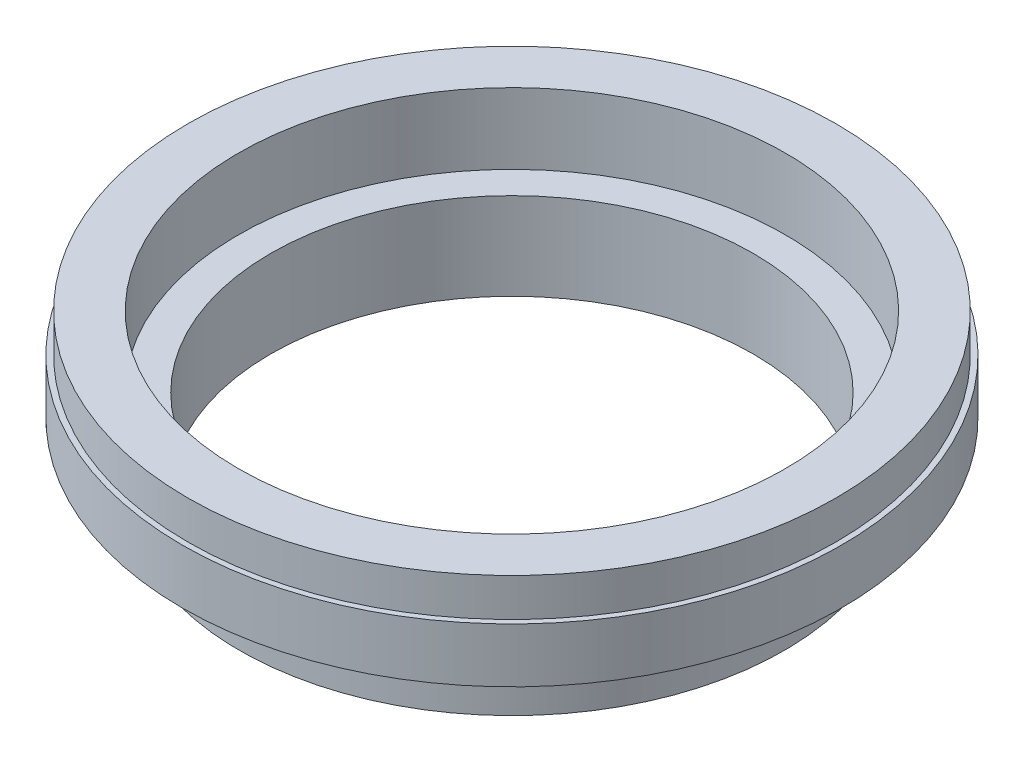
ISO-10303-21;
HEADER;
FILE_DESCRIPTION(('STEP AP214'),'2;1');
FILE_NAME('part.step','',(''),(''),'','','');
FILE_SCHEMA(('AUTOMOTIVE_DESIGN { 1 0 10303 214 1 1 1 1 }'));
ENDSEC;
DATA;
#1=APPLICATION_CONTEXT('core data for automotive mechanical design processes');
#2=APPLICATION_PROTOCOL_DEFINITION('international standard','automotive_design',2000,#1);
#3=PRODUCT_CONTEXT('',#1,'mechanical');
#4=PRODUCT('Part','Part','',(#3));
#5=PRODUCT_RELATED_PRODUCT_CATEGORY('part','',(#4));
#6=PRODUCT_DEFINITION_FORMATION('','',#4);
#7=PRODUCT_DEFINITION_CONTEXT('part definition',#1,'design');
#8=PRODUCT_DEFINITION('design','',#6,#7);
#9=PRODUCT_DEFINITION_SHAPE('','',#8);
#10=(LENGTH_UNIT() NAMED_UNIT(*) SI_UNIT(.MILLI.,.METRE.));
#11=(NAMED_UNIT(*) PLANE_ANGLE_UNIT() SI_UNIT($,.RADIAN.));
#12=(NAMED_UNIT(*) SI_UNIT($,.STERADIAN.) SOLID_ANGLE_UNIT());
#13=UNCERTAINTY_MEASURE_WITH_UNIT(LENGTH_MEASURE(1.E-05),#10,'distance_accuracy_value','');
#14=(GEOMETRIC_REPRESENTATION_CONTEXT(3) GLOBAL_UNCERTAINTY_ASSIGNED_CONTEXT((#13)) GLOBAL_UNIT_ASSIGNED_CONTEXT((#10,
#11,#12)) REPRESENTATION_CONTEXT('',''));
#15=CARTESIAN_POINT('',(0.,0.,0.));
#16=DIRECTION('',(0.,0.,1.));
#17=DIRECTION('',(1.,0.,0.));
#18=AXIS2_PLACEMENT_3D('',#15,#16,#17);
#19=CARTESIAN_POINT('',(0.,3.048,0.));
#20=DIRECTION('',(0.,-1.,0.));
#21=DIRECTION('',(0.,0.,-1.));
#22=AXIS2_PLACEMENT_3D('',#19,#20,#21);
#23=CYLINDRICAL_SURFACE('',#22,11.25);
#24=CARTESIAN_POINT('',(0.,0.,0.));
#25=DIRECTION('',(0.,1.,0.));
#26=DIRECTION('',(0.,0.,1.));
#27=AXIS2_PLACEMENT_3D('',#24,#25,#26);
#28=CIRCLE('',#27,11.25);
#29=CARTESIAN_POINT('',(0.,0.,-11.25));
#30=VERTEX_POINT('',#29);
#31=EDGE_CURVE('E57',#30,#30,#28,.T.);
#32=CARTESIAN_POINT('',(0.,4.064,0.));
#33=DIRECTION('',(0.,1.,0.));
#34=DIRECTION('',(0.,0.,1.));
#35=AXIS2_PLACEMENT_3D('',#32,#33,#34);
#36=CIRCLE('',#35,11.25);
#37=CARTESIAN_POINT('',(0.,4.064,-11.25));
#38=VERTEX_POINT('',#37);
#39=EDGE_CURVE('E39',#38,#38,#36,.T.);
#40=CARTESIAN_POINT('',(0.,0.,-11.25));
#41=CARTESIAN_POINT('',(0.,0.0423333333333333,-11.25));
#42=CARTESIAN_POINT('',(0.,0.0846666666666666,-11.25));
#43=CARTESIAN_POINT('',(0.,0.169333333333333,-11.25));
#44=CARTESIAN_POINT('',(0.,0.211666666666667,-11.25));
#45=CARTESIAN_POINT('',(0.,0.296333333333333,-11.25));
#46=CARTESIAN_POINT('',(0.,0.338666666666667,-11.25));
#47=CARTESIAN_POINT('',(0.,0.423333333333333,-11.25));
#48=CARTESIAN_POINT('',(0.,0.465666666666666,-11.25));
#49=CARTESIAN_POINT('',(0.,0.550333333333333,-11.25));
#50=CARTESIAN_POINT('',(0.,0.592666666666667,-11.25));
#51=CARTESIAN_POINT('',(0.,0.677333333333333,-11.25));
#52=CARTESIAN_POINT('',(0.,0.719666666666667,-11.25));
#53=CARTESIAN_POINT('',(0.,0.804333333333333,-11.25));
#54=CARTESIAN_POINT('',(0.,0.846666666666667,-11.25));
#55=CARTESIAN_POINT('',(0.,0.931333333333333,-11.25));
#56=CARTESIAN_POINT('',(0.,0.973666666666667,-11.25));
#57=CARTESIAN_POINT('',(0.,1.05833333333333,-11.25));
#58=CARTESIAN_POINT('',(0.,1.10066666666667,-11.25));
#59=CARTESIAN_POINT('',(0.,1.18533333333333,-11.25));
#60=CARTESIAN_POINT('',(0.,1.22766666666667,-11.25));
#61=CARTESIAN_POINT('',(0.,1.31233333333333,-11.25));
#62=CARTESIAN_POINT('',(0.,1.35466666666667,-11.25));
#63=CARTESIAN_POINT('',(0.,1.43933333333333,-11.25));
#64=CARTESIAN_POINT('',(0.,1.48166666666667,-11.25));
#65=CARTESIAN_POINT('',(0.,1.56633333333333,-11.25));
#66=CARTESIAN_POINT('',(0.,1.60866666666667,-11.25));
#67=CARTESIAN_POINT('',(0.,1.69333333333333,-11.25));
#68=CARTESIAN_POINT('',(0.,1.73566666666667,-11.25));
#69=CARTESIAN_POINT('',(0.,1.82033333333333,-11.25));
#70=CARTESIAN_POINT('',(0.,1.86266666666667,-11.25));
#71=CARTESIAN_POINT('',(0.,1.94733333333333,-11.25));
#72=CARTESIAN_POINT('',(0.,1.98966666666667,-11.25));
#73=CARTESIAN_POINT('',(0.,2.07433333333333,-11.25));
#74=CARTESIAN_POINT('',(0.,2.11666666666667,-11.25));
#75=CARTESIAN_POINT('',(0.,2.20133333333333,-11.25));
#76=CARTESIAN_POINT('',(0.,2.24366666666667,-11.25));
#77=CARTESIAN_POINT('',(0.,2.32833333333333,-11.25));
#78=CARTESIAN_POINT('',(0.,2.37066666666667,-11.25));
#79=CARTESIAN_POINT('',(0.,2.45533333333333,-11.25));
#80=CARTESIAN_POINT('',(0.,2.49766666666667,-11.25));
#81=CARTESIAN_POINT('',(0.,2.58233333333333,-11.25));
#82=CARTESIAN_POINT('',(0.,2.62466666666667,-11.25));
#83=CARTESIAN_POINT('',(0.,2.70933333333333,-11.25));
#84=CARTESIAN_POINT('',(0.,2.75166666666667,-11.25));
#85=CARTESIAN_POINT('',(0.,2.83633333333333,-11.25));
#86=CARTESIAN_POINT('',(0.,2.87866666666667,-11.25));
#87=CARTESIAN_POINT('',(0.,2.96333333333333,-11.25));
#88=CARTESIAN_POINT('',(0.,3.00566666666667,-11.25));
#89=CARTESIAN_POINT('',(0.,3.09033333333333,-11.25));
#90=CARTESIAN_POINT('',(0.,3.13266666666667,-11.25));
#91=CARTESIAN_POINT('',(0.,3.21733333333333,-11.25));
#92=CARTESIAN_POINT('',(0.,3.25966666666667,-11.25));
#93=CARTESIAN_POINT('',(0.,3.34433333333333,-11.25));
#94=CARTESIAN_POINT('',(0.,3.38666666666667,-11.25));
#95=CARTESIAN_POINT('',(0.,3.47133333333333,-11.25));
#96=CARTESIAN_POINT('',(0.,3.51366666666667,-11.25));
#97=CARTESIAN_POINT('',(0.,3.59833333333333,-11.25));
#98=CARTESIAN_POINT('',(0.,3.64066666666667,-11.25));
#99=CARTESIAN_POINT('',(0.,3.72533333333333,-11.25));
#100=CARTESIAN_POINT('',(0.,3.76766666666667,-11.25));
#101=CARTESIAN_POINT('',(0.,3.85233333333333,-11.25));
#102=CARTESIAN_POINT('',(0.,3.89466666666667,-11.25));
#103=CARTESIAN_POINT('',(0.,3.97933333333333,-11.25));
#104=CARTESIAN_POINT('',(0.,4.02166666666667,-11.25));
#105=CARTESIAN_POINT('',(0.,4.064,-11.25));
#106=B_SPLINE_CURVE_WITH_KNOTS('',3,(#40,#41,#42,#43,#44,#45,#46,#47,#48,#49,#50,#51,#52,#53,
#54,#55,#56,#57,#58,#59,#60,#61,#62,#63,#64,#65,#66,#67,#68,#69,#70,#71,#72,#73,#74,#75,#76,#77,
#78,#79,#80,#81,#82,#83,#84,#85,#86,#87,#88,#89,#90,#91,#92,#93,#94,#95,#96,#97,#98,#99,#100,
#101,#102,#103,#104,#105),.UNSPECIFIED.,.F.,.F.,(4,2,2,2,2,2,2,2,2,2,2,2,2,2,2,2,2,2,2,2,2,2,2,
2,2,2,2,2,2,2,2,2,4),(0.,0.127,0.254,0.381,0.508,0.635,0.762,0.889,1.016,1.143,1.27,1.397,1.524,
1.651,1.778,1.905,2.032,2.159,2.286,2.413,2.54,2.667,2.794,2.921,3.048,3.175,3.302,3.429,3.556,
3.683,3.81,3.937,4.064),.UNSPECIFIED.);
#107=EDGE_CURVE('BSEAM35',#30,#38,#106,.T.);
#108=ORIENTED_EDGE('',*,*,#31,.F.);
#109=ORIENTED_EDGE('',*,*,#39,.T.);
#110=ORIENTED_EDGE('',*,*,#107,.T.);
#111=ORIENTED_EDGE('',*,*,#107,.F.);
#112=EDGE_LOOP('',(#108,#110,#109,#111));
#113=FACE_BOUND('',#112,.T.);
#114=ADVANCED_FACE('F35',(#113),#23,.F.);
#115=CARTESIAN_POINT('',(0.,0.,0.));
#116=DIRECTION('',(0.,1.,0.));
#117=DIRECTION('',(0.,0.,1.));
#118=AXIS2_PLACEMENT_3D('',#115,#116,#117);
#119=PLANE('',#118);
#120=CARTESIAN_POINT('',(0.,0.,0.));
#121=DIRECTION('',(0.,1.,0.));
#122=DIRECTION('',(0.,0.,1.));
#123=AXIS2_PLACEMENT_3D('',#120,#121,#122);
#124=CIRCLE('',#123,12.7);
#125=CARTESIAN_POINT('',(0.,0.,-12.7));
#126=VERTEX_POINT('',#125);
#127=EDGE_CURVE('E48',#126,#126,#124,.T.);
#128=ORIENTED_EDGE('',*,*,#127,.F.);
#129=EDGE_LOOP('',(#128));
#130=FACE_BOUND('',#129,.T.);
#131=ORIENTED_EDGE('',*,*,#31,.T.);
#132=EDGE_LOOP('',(#131));
#133=FACE_BOUND('',#132,.T.);
#134=ADVANCED_FACE('F66',(#130,#133),#119,.F.);
#135=CARTESIAN_POINT('',(0.,3.048,0.));
#136=DIRECTION('',(0.,-1.,0.));
#137=DIRECTION('',(0.,0.,-1.));
#138=AXIS2_PLACEMENT_3D('',#135,#136,#137);
#139=CYLINDRICAL_SURFACE('',#138,12.7);
#140=CARTESIAN_POINT('',(0.,3.048,0.));
#141=DIRECTION('',(0.,1.,0.));
#142=DIRECTION('',(0.,0.,1.));
#143=AXIS2_PLACEMENT_3D('',#140,#141,#142);
#144=CIRCLE('',#143,12.7);
#145=CARTESIAN_POINT('',(0.,3.048,-12.7));
#146=VERTEX_POINT('',#145);
#147=EDGE_CURVE('E43',#146,#146,#144,.T.);
#148=CARTESIAN_POINT('',(0.,3.048,-12.7));
#149=CARTESIAN_POINT('',(0.,3.01625,-12.7));
#150=CARTESIAN_POINT('',(0.,2.9845,-12.7));
#151=CARTESIAN_POINT('',(0.,2.921,-12.7));
#152=CARTESIAN_POINT('',(0.,2.88925,-12.7));
#153=CARTESIAN_POINT('',(0.,2.82575,-12.7));
#154=CARTESIAN_POINT('',(0.,2.794,-12.7));
#155=CARTESIAN_POINT('',(0.,2.7305,-12.7));
#156=CARTESIAN_POINT('',(0.,2.69875,-12.7));
#157=CARTESIAN_POINT('',(0.,2.63525,-12.7));
#158=CARTESIAN_POINT('',(0.,2.6035,-12.7));
#159=CARTESIAN_POINT('',(0.,2.54,-12.7));
#160=CARTESIAN_POINT('',(0.,2.50825,-12.7));
#161=CARTESIAN_POINT('',(0.,2.44475,-12.7));
#162=CARTESIAN_POINT('',(0.,2.413,-12.7));
#163=CARTESIAN_POINT('',(0.,2.3495,-12.7));
#164=CARTESIAN_POINT('',(0.,2.31775,-12.7));
#165=CARTESIAN_POINT('',(0.,2.25425,-12.7));
#166=CARTESIAN_POINT('',(0.,2.2225,-12.7));
#167=CARTESIAN_POINT('',(0.,2.159,-12.7));
#168=CARTESIAN_POINT('',(0.,2.12725,-12.7));
#169=CARTESIAN_POINT('',(0.,2.06375,-12.7));
#170=CARTESIAN_POINT('',(0.,2.032,-12.7));
#171=CARTESIAN_POINT('',(0.,1.9685,-12.7));
#172=CARTESIAN_POINT('',(0.,1.93675,-12.7));
#173=CARTESIAN_POINT('',(0.,1.87325,-12.7));
#174=CARTESIAN_POINT('',(0.,1.8415,-12.7));
#175=CARTESIAN_POINT('',(0.,1.778,-12.7));
#176=CARTESIAN_POINT('',(0.,1.74625,-12.7));
#177=CARTESIAN_POINT('',(0.,1.68275,-12.7));
#178=CARTESIAN_POINT('',(0.,1.651,-12.7));
#179=CARTESIAN_POINT('',(0.,1.5875,-12.7));
#180=CARTESIAN_POINT('',(0.,1.55575,-12.7));
#181=CARTESIAN_POINT('',(0.,1.49225,-12.7));
#182=CARTESIAN_POINT('',(0.,1.4605,-12.7));
#183=CARTESIAN_POINT('',(0.,1.397,-12.7));
#184=CARTESIAN_POINT('',(0.,1.36525,-12.7));
#185=CARTESIAN_POINT('',(0.,1.30175,-12.7));
#186=CARTESIAN_POINT('',(0.,1.27,-12.7));
#187=CARTESIAN_POINT('',(0.,1.2065,-12.7));
#188=CARTESIAN_POINT('',(0.,1.17475,-12.7));
#189=CARTESIAN_POINT('',(0.,1.11125,-12.7));
#190=CARTESIAN_POINT('',(0.,1.0795,-12.7));
#191=CARTESIAN_POINT('',(0.,1.016,-12.7));
#192=CARTESIAN_POINT('',(0.,0.98425,-12.7));
#193=CARTESIAN_POINT('',(0.,0.92075,-12.7));
#194=CARTESIAN_POINT('',(0.,0.889,-12.7));
#195=CARTESIAN_POINT('',(0.,0.8255,-12.7));
#196=CARTESIAN_POINT('',(0.,0.79375,-12.7));
#197=CARTESIAN_POINT('',(0.,0.73025,-12.7));
#198=CARTESIAN_POINT('',(0.,0.6985,-12.7));
#199=CARTESIAN_POINT('',(0.,0.635,-12.7));
#200=CARTESIAN_POINT('',(0.,0.60325,-12.7));
#201=CARTESIAN_POINT('',(0.,0.53975,-12.7));
#202=CARTESIAN_POINT('',(0.,0.508,-12.7));
#203=CARTESIAN_POINT('',(0.,0.4445,-12.7));
#204=CARTESIAN_POINT('',(0.,0.41275,-12.7));
#205=CARTESIAN_POINT('',(0.,0.34925,-12.7));
#206=CARTESIAN_POINT('',(0.,0.3175,-12.7));
#207=CARTESIAN_POINT('',(0.,0.254,-12.7));
#208=CARTESIAN_POINT('',(0.,0.22225,-12.7));
#209=CARTESIAN_POINT('',(0.,0.15875,-12.7));
#210=CARTESIAN_POINT('',(0.,0.127,-12.7));
#211=CARTESIAN_POINT('',(0.,0.0634999999999999,-12.7));
#212=CARTESIAN_POINT('',(0.,0.03175,-12.7));
#213=CARTESIAN_POINT('',(0.,0.,-12.7));
#214=B_SPLINE_CURVE_WITH_KNOTS('',3,(#148,#149,#150,#151,#152,#153,#154,#155,#156,#157,#158,
#159,#160,#161,#162,#163,#164,#165,#166,#167,#168,#169,#170,#171,#172,#173,#174,#175,#176,#177,
#178,#179,#180,#181,#182,#183,#184,#185,#186,#187,#188,#189,#190,#191,#192,#193,#194,#195,#196,
#197,#198,#199,#200,#201,#202,#203,#204,#205,#206,#207,#208,#209,#210,#211,#212,#213),
.UNSPECIFIED.,.F.,.F.,(4,2,2,2,2,2,2,2,2,2,2,2,2,2,2,2,2,2,2,2,2,2,2,2,2,2,2,2,2,2,2,2,4),(0.,
0.0952500000000003,0.1905,0.28575,0.381,0.47625,0.5715,0.66675,0.762,0.85725,0.9525,1.04775,
1.143,1.23825,1.3335,1.42875,1.524,1.61925,1.7145,1.80975,1.905,2.00025,2.0955,2.19075,2.286,
2.38125,2.4765,2.57175,2.667,2.76225,2.8575,2.95275,3.048),.UNSPECIFIED.);
#215=EDGE_CURVE('BSEAM37',#146,#126,#214,.T.);
#216=ORIENTED_EDGE('',*,*,#147,.F.);
#217=ORIENTED_EDGE('',*,*,#127,.T.);
#218=ORIENTED_EDGE('',*,*,#215,.T.);
#219=ORIENTED_EDGE('',*,*,#215,.F.);
#220=EDGE_LOOP('',(#216,#218,#217,#219));
#221=FACE_BOUND('',#220,.T.);
#222=ADVANCED_FACE('F37',(#221),#139,.T.);
#223=CARTESIAN_POINT('',(0.,5.588,0.));
#224=DIRECTION('',(0.,-1.,0.));
#225=DIRECTION('',(0.,0.,-1.));
#226=AXIS2_PLACEMENT_3D('',#223,#224,#225);
#227=CYLINDRICAL_SURFACE('',#226,15.367);
#228=CARTESIAN_POINT('',(0.,5.588,0.));
#229=DIRECTION('',(0.,1.,0.));
#230=DIRECTION('',(0.,0.,1.));
#231=AXIS2_PLACEMENT_3D('',#228,#229,#230);
#232=CIRCLE('',#231,15.367);
#233=CARTESIAN_POINT('',(0.,5.588,15.367));
#234=VERTEX_POINT('',#233);
#235=EDGE_CURVE('E54',#234,#234,#232,.T.);
#236=ORIENTED_EDGE('',*,*,#235,.F.);
#237=EDGE_LOOP('',(#236));
#238=FACE_BOUND('',#237,.T.);
#239=CARTESIAN_POINT('',(0.,3.048,0.));
#240=DIRECTION('',(0.,1.,0.));
#241=DIRECTION('',(0.,0.,1.));
#242=AXIS2_PLACEMENT_3D('',#239,#240,#241);
#243=CIRCLE('',#242,15.367);
#244=CARTESIAN_POINT('',(0.,3.048,15.367));
#245=VERTEX_POINT('',#244);
#246=EDGE_CURVE('E58',#245,#245,#243,.T.);
#247=ORIENTED_EDGE('',*,*,#246,.T.);
#248=EDGE_LOOP('',(#247));
#249=FACE_BOUND('',#248,.T.);
#250=ADVANCED_FACE('F108',(#238,#249),#227,.T.);
#251=CARTESIAN_POINT('',(0.,5.588,0.));
#252=DIRECTION('',(0.,1.,0.));
#253=DIRECTION('',(0.,0.,1.));
#254=AXIS2_PLACEMENT_3D('',#251,#252,#253);
#255=PLANE('',#254);
#256=CARTESIAN_POINT('',(0.,5.588,0.));
#257=DIRECTION('',(0.,1.,0.));
#258=DIRECTION('',(0.,0.,1.));
#259=AXIS2_PLACEMENT_3D('',#256,#257,#258);
#260=CIRCLE('',#259,15.113);
#261=CARTESIAN_POINT('',(0.,5.588,15.113));
#262=VERTEX_POINT('',#261);
#263=EDGE_CURVE('E10',#262,#262,#260,.T.);
#264=ORIENTED_EDGE('',*,*,#263,.F.);
#265=EDGE_LOOP('',(#264));
#266=FACE_BOUND('',#265,.T.);
#267=ORIENTED_EDGE('',*,*,#235,.T.);
#268=EDGE_LOOP('',(#267));
#269=FACE_BOUND('',#268,.T.);
#270=ADVANCED_FACE('F102',(#266,#269),#255,.T.);
#271=CARTESIAN_POINT('',(0.,3.048,0.));
#272=DIRECTION('',(0.,1.,0.));
#273=DIRECTION('',(0.,0.,1.));
#274=AXIS2_PLACEMENT_3D('',#271,#272,#273);
#275=PLANE('',#274);
#276=ORIENTED_EDGE('',*,*,#147,.T.);
#277=EDGE_LOOP('',(#276));
#278=FACE_BOUND('',#277,.T.);
#279=ORIENTED_EDGE('',*,*,#246,.F.);
#280=EDGE_LOOP('',(#279));
#281=FACE_BOUND('',#280,.T.);
#282=ADVANCED_FACE('F97',(#278,#281),#275,.F.);
#283=CARTESIAN_POINT('',(0.,7.366,0.));
#284=DIRECTION('',(0.,-1.,0.));
#285=DIRECTION('',(0.,0.,-1.));
#286=AXIS2_PLACEMENT_3D('',#283,#284,#285);
#287=CYLINDRICAL_SURFACE('',#286,15.113);
#288=CARTESIAN_POINT('',(0.,7.366,0.));
#289=DIRECTION('',(0.,1.,0.));
#290=DIRECTION('',(0.,0.,1.));
#291=AXIS2_PLACEMENT_3D('',#288,#289,#290);
#292=CIRCLE('',#291,15.113);
#293=CARTESIAN_POINT('',(0.,7.366,15.113));
#294=VERTEX_POINT('',#293);
#295=EDGE_CURVE('E52',#294,#294,#292,.T.);
#296=ORIENTED_EDGE('',*,*,#295,.F.);
#297=EDGE_LOOP('',(#296));
#298=FACE_BOUND('',#297,.T.);
#299=ORIENTED_EDGE('',*,*,#263,.T.);
#300=EDGE_LOOP('',(#299));
#301=FACE_BOUND('',#300,.T.);
#302=ADVANCED_FACE('F92',(#298,#301),#287,.T.);
#303=CARTESIAN_POINT('',(0.,7.366,0.));
#304=DIRECTION('',(0.,1.,0.));
#305=DIRECTION('',(0.,0.,1.));
#306=AXIS2_PLACEMENT_3D('',#303,#304,#305);
#307=PLANE('',#306);
#308=CARTESIAN_POINT('',(0.,7.366,0.));
#309=DIRECTION('',(0.,1.,0.));
#310=DIRECTION('',(0.,0.,1.));
#311=AXIS2_PLACEMENT_3D('',#308,#309,#310);
#312=CIRCLE('',#311,12.75);
#313=CARTESIAN_POINT('',(0.,7.366,12.75));
#314=VERTEX_POINT('',#313);
#315=EDGE_CURVE('E80',#314,#314,#312,.T.);
#316=ORIENTED_EDGE('',*,*,#315,.F.);
#317=EDGE_LOOP('',(#316));
#318=FACE_BOUND('',#317,.T.);
#319=ORIENTED_EDGE('',*,*,#295,.T.);
#320=EDGE_LOOP('',(#319));
#321=FACE_BOUND('',#320,.T.);
#322=ADVANCED_FACE('F89',(#318,#321),#307,.T.);
#323=CARTESIAN_POINT('',(0.,4.064,0.));
#324=DIRECTION('',(0.,1.,0.));
#325=DIRECTION('',(0.,0.,1.));
#326=AXIS2_PLACEMENT_3D('',#323,#324,#325);
#327=CYLINDRICAL_SURFACE('',#326,12.75);
#328=CARTESIAN_POINT('',(0.,4.064,0.));
#329=DIRECTION('',(0.,1.,0.));
#330=DIRECTION('',(0.,0.,1.));
#331=AXIS2_PLACEMENT_3D('',#328,#329,#330);
#332=CIRCLE('',#331,12.75);
#333=CARTESIAN_POINT('',(0.,4.064,12.75));
#334=VERTEX_POINT('',#333);
#335=EDGE_CURVE('E77',#334,#334,#332,.T.);
#336=CARTESIAN_POINT('',(0.,4.064,12.75));
#337=CARTESIAN_POINT('',(0.,4.09839583333333,12.75));
#338=CARTESIAN_POINT('',(0.,4.13279166666667,12.75));
#339=CARTESIAN_POINT('',(0.,4.20158333333333,12.75));
#340=CARTESIAN_POINT('',(0.,4.23597916666667,12.75));
#341=CARTESIAN_POINT('',(0.,4.30477083333333,12.75));
#342=CARTESIAN_POINT('',(0.,4.33916666666667,12.75));
#343=CARTESIAN_POINT('',(0.,4.40795833333333,12.75));
#344=CARTESIAN_POINT('',(0.,4.44235416666667,12.75));
#345=CARTESIAN_POINT('',(0.,4.51114583333333,12.75));
#346=CARTESIAN_POINT('',(0.,4.54554166666667,12.75));
#347=CARTESIAN_POINT('',(0.,4.61433333333333,12.75));
#348=CARTESIAN_POINT('',(0.,4.64872916666667,12.75));
#349=CARTESIAN_POINT('',(0.,4.71752083333333,12.75));
#350=CARTESIAN_POINT('',(0.,4.75191666666667,12.75));
#351=CARTESIAN_POINT('',(0.,4.82070833333333,12.75));
#352=CARTESIAN_POINT('',(0.,4.85510416666667,12.75));
#353=CARTESIAN_POINT('',(0.,4.92389583333333,12.75));
#354=CARTESIAN_POINT('',(0.,4.95829166666667,12.75));
#355=CARTESIAN_POINT('',(0.,5.02708333333333,12.75));
#356=CARTESIAN_POINT('',(0.,5.06147916666667,12.75));
#357=CARTESIAN_POINT('',(0.,5.13027083333333,12.75));
#358=CARTESIAN_POINT('',(0.,5.16466666666667,12.75));
#359=CARTESIAN_POINT('',(0.,5.23345833333333,12.75));
#360=CARTESIAN_POINT('',(0.,5.26785416666667,12.75));
#361=CARTESIAN_POINT('',(0.,5.33664583333333,12.75));
#362=CARTESIAN_POINT('',(0.,5.37104166666667,12.75));
#363=CARTESIAN_POINT('',(0.,5.43983333333333,12.75));
#364=CARTESIAN_POINT('',(0.,5.47422916666667,12.75));
#365=CARTESIAN_POINT('',(0.,5.54302083333333,12.75));
#366=CARTESIAN_POINT('',(0.,5.57741666666667,12.75));
#367=CARTESIAN_POINT('',(0.,5.64620833333333,12.75));
#368=CARTESIAN_POINT('',(0.,5.68060416666667,12.75));
#369=CARTESIAN_POINT('',(0.,5.74939583333333,12.75));
#370=CARTESIAN_POINT('',(0.,5.78379166666667,12.75));
#371=CARTESIAN_POINT('',(0.,5.85258333333333,12.75));
#372=CARTESIAN_POINT('',(0.,5.88697916666667,12.75));
#373=CARTESIAN_POINT('',(0.,5.95577083333333,12.75));
#374=CARTESIAN_POINT('',(0.,5.99016666666667,12.75));
#375=CARTESIAN_POINT('',(0.,6.05895833333333,12.75));
#376=CARTESIAN_POINT('',(0.,6.09335416666667,12.75));
#377=CARTESIAN_POINT('',(0.,6.16214583333333,12.75));
#378=CARTESIAN_POINT('',(0.,6.19654166666667,12.75));
#379=CARTESIAN_POINT('',(0.,6.26533333333333,12.75));
#380=CARTESIAN_POINT('',(0.,6.29972916666667,12.75));
#381=CARTESIAN_POINT('',(0.,6.36852083333333,12.75));
#382=CARTESIAN_POINT('',(0.,6.40291666666667,12.75));
#383=CARTESIAN_POINT('',(0.,6.47170833333333,12.75));
#384=CARTESIAN_POINT('',(0.,6.50610416666667,12.75));
#385=CARTESIAN_POINT('',(0.,6.57489583333333,12.75));
#386=CARTESIAN_POINT('',(0.,6.60929166666667,12.75));
#387=CARTESIAN_POINT('',(0.,6.67808333333333,12.75));
#388=CARTESIAN_POINT('',(0.,6.71247916666667,12.75));
#389=CARTESIAN_POINT('',(0.,6.78127083333333,12.75));
#390=CARTESIAN_POINT('',(0.,6.81566666666667,12.75));
#391=CARTESIAN_POINT('',(0.,6.88445833333333,12.75));
#392=CARTESIAN_POINT('',(0.,6.91885416666667,12.75));
#393=CARTESIAN_POINT('',(0.,6.98764583333333,12.75));
#394=CARTESIAN_POINT('',(0.,7.02204166666667,12.75));
#395=CARTESIAN_POINT('',(0.,7.09083333333333,12.75));
#396=CARTESIAN_POINT('',(0.,7.12522916666667,12.75));
#397=CARTESIAN_POINT('',(0.,7.19402083333333,12.75));
#398=CARTESIAN_POINT('',(0.,7.22841666666667,12.75));
#399=CARTESIAN_POINT('',(0.,7.29720833333333,12.75));
#400=CARTESIAN_POINT('',(0.,7.33160416666667,12.75));
#401=CARTESIAN_POINT('',(0.,7.366,12.75));
#402=B_SPLINE_CURVE_WITH_KNOTS('',3,(#336,#337,#338,#339,#340,#341,#342,#343,#344,#345,#346,
#347,#348,#349,#350,#351,#352,#353,#354,#355,#356,#357,#358,#359,#360,#361,#362,#363,#364,#365,
#366,#367,#368,#369,#370,#371,#372,#373,#374,#375,#376,#377,#378,#379,#380,#381,#382,#383,#384,
#385,#386,#387,#388,#389,#390,#391,#392,#393,#394,#395,#396,#397,#398,#399,#400,#401),
.UNSPECIFIED.,.F.,.F.,(4,2,2,2,2,2,2,2,2,2,2,2,2,2,2,2,2,2,2,2,2,2,2,2,2,2,2,2,2,2,2,2,4),(0.,
0.1031875,0.206375,0.3095625,0.41275,0.5159375,0.619125,0.7223125,0.8255,0.9286875,1.031875,
1.1350625,1.23825,1.3414375,1.444625,1.5478125,1.651,1.7541875,1.857375,1.9605625,2.06375,
2.1669375,2.270125,2.3733125,2.4765,2.5796875,2.682875,2.7860625,2.88925,2.9924375,3.095625,
3.1988125,3.302),.UNSPECIFIED.);
#403=EDGE_CURVE('BSEAM87',#334,#314,#402,.T.);
#404=ORIENTED_EDGE('',*,*,#335,.F.);
#405=ORIENTED_EDGE('',*,*,#315,.T.);
#406=ORIENTED_EDGE('',*,*,#403,.T.);
#407=ORIENTED_EDGE('',*,*,#403,.F.);
#408=EDGE_LOOP('',(#404,#406,#405,#407));
#409=FACE_BOUND('',#408,.T.);
#410=ADVANCED_FACE('F87',(#409),#327,.F.);
#411=CARTESIAN_POINT('',(0.,4.064,0.));
#412=DIRECTION('',(0.,1.,0.));
#413=DIRECTION('',(0.,0.,1.));
#414=AXIS2_PLACEMENT_3D('',#411,#412,#413);
#415=PLANE('',#414);
#416=ORIENTED_EDGE('',*,*,#39,.F.);
#417=EDGE_LOOP('',(#416));
#418=FACE_BOUND('',#417,.T.);
#419=ORIENTED_EDGE('',*,*,#335,.T.);
#420=EDGE_LOOP('',(#419));
#421=FACE_BOUND('',#420,.T.);
#422=ADVANCED_FACE('F154',(#418,#421),#415,.T.);
#423=CLOSED_SHELL('',(#114,#134,#222,#250,#270,#282,#302,#322,#410,#422));
#424=MANIFOLD_SOLID_BREP('B2',#423);
#425=ADVANCED_BREP_SHAPE_REPRESENTATION('',(#18,#424),#14);
#426=SHAPE_DEFINITION_REPRESENTATION(#9,#425);
ENDSEC;
END-ISO-10303-21;
